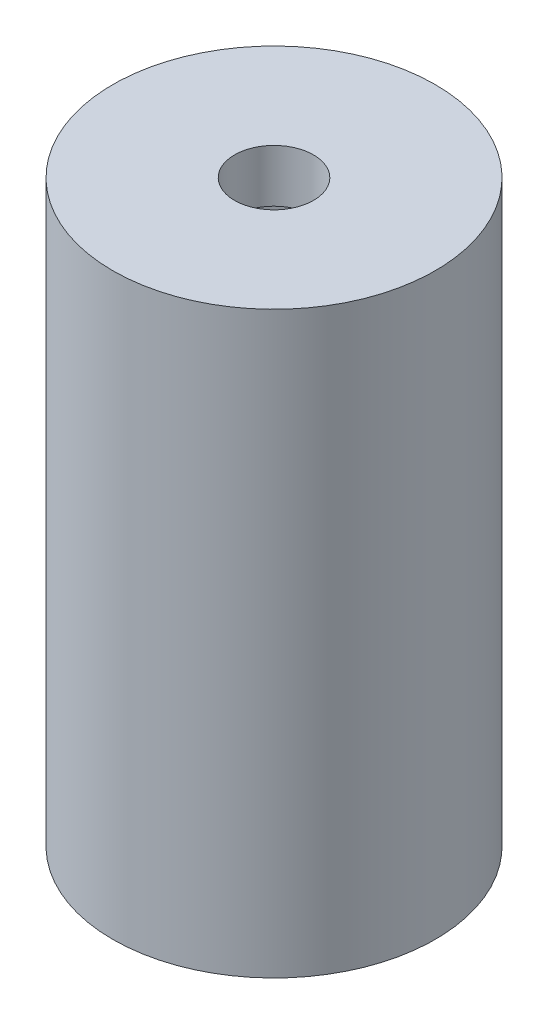
ISO-10303-21;
HEADER;
FILE_DESCRIPTION(('STEP AP214'),'2;1');
FILE_NAME('part.step','',(''),(''),'','','');
FILE_SCHEMA(('AUTOMOTIVE_DESIGN { 1 0 10303 214 1 1 1 1 }'));
ENDSEC;
DATA;
#1=APPLICATION_CONTEXT('core data for automotive mechanical design processes');
#2=APPLICATION_PROTOCOL_DEFINITION('international standard','automotive_design',2000,#1);
#3=PRODUCT_CONTEXT('',#1,'mechanical');
#4=PRODUCT('Part','Part','',(#3));
#5=PRODUCT_RELATED_PRODUCT_CATEGORY('part','',(#4));
#6=PRODUCT_DEFINITION_FORMATION('','',#4);
#7=PRODUCT_DEFINITION_CONTEXT('part definition',#1,'design');
#8=PRODUCT_DEFINITION('design','',#6,#7);
#9=PRODUCT_DEFINITION_SHAPE('','',#8);
#10=(LENGTH_UNIT() NAMED_UNIT(*) SI_UNIT(.MILLI.,.METRE.));
#11=(NAMED_UNIT(*) PLANE_ANGLE_UNIT() SI_UNIT($,.RADIAN.));
#12=(NAMED_UNIT(*) SI_UNIT($,.STERADIAN.) SOLID_ANGLE_UNIT());
#13=UNCERTAINTY_MEASURE_WITH_UNIT(LENGTH_MEASURE(1.E-05),#10,'distance_accuracy_value','');
#14=(GEOMETRIC_REPRESENTATION_CONTEXT(3) GLOBAL_UNCERTAINTY_ASSIGNED_CONTEXT((#13)) GLOBAL_UNIT_ASSIGNED_CONTEXT((#10,
#11,#12)) REPRESENTATION_CONTEXT('',''));
#15=CARTESIAN_POINT('',(0.,0.,0.));
#16=DIRECTION('',(0.,0.,1.));
#17=DIRECTION('',(1.,0.,0.));
#18=AXIS2_PLACEMENT_3D('',#15,#16,#17);
#19=CARTESIAN_POINT('',(0.,40.,0.));
#20=DIRECTION('',(0.,-1.,0.));
#21=DIRECTION('',(0.,0.,-1.));
#22=AXIS2_PLACEMENT_3D('',#19,#20,#21);
#23=CYLINDRICAL_SURFACE('',#22,12.25);
#24=CARTESIAN_POINT('',(0.,0.,0.));
#25=DIRECTION('',(0.,1.,0.));
#26=DIRECTION('',(0.,0.,1.));
#27=AXIS2_PLACEMENT_3D('',#24,#25,#26);
#28=CIRCLE('',#27,12.25);
#29=CARTESIAN_POINT('',(-3.,0.,-11.8769735202197));
#30=VERTEX_POINT('',#29);
#31=CARTESIAN_POINT('',(3.,0.,-11.8769735202197));
#32=VERTEX_POINT('',#31);
#33=EDGE_CURVE('E105',#30,#32,#28,.T.);
#34=ORIENTED_EDGE('',*,*,#33,.T.);
#35=DIRECTION('',(0.,-1.,0.));
#36=VECTOR('',#35,1.);
#37=CARTESIAN_POINT('',(3.,40.,-11.8769735202197));
#38=LINE('',#37,#36);
#39=CARTESIAN_POINT('',(3.,40.,-11.8769735202197));
#40=VERTEX_POINT('',#39);
#41=EDGE_CURVE('E11',#40,#32,#38,.T.);
#42=ORIENTED_EDGE('',*,*,#41,.F.);
#43=CARTESIAN_POINT('',(0.,40.,0.));
#44=DIRECTION('',(0.,1.,0.));
#45=DIRECTION('',(0.,0.,1.));
#46=AXIS2_PLACEMENT_3D('',#43,#44,#45);
#47=CIRCLE('',#46,12.25);
#48=CARTESIAN_POINT('',(-3.,40.,-11.8769735202197));
#49=VERTEX_POINT('',#48);
#50=EDGE_CURVE('E97',#40,#49,#47,.T.);
#51=ORIENTED_EDGE('',*,*,#50,.T.);
#52=DIRECTION('',(0.,-1.,0.));
#53=VECTOR('',#52,1.);
#54=CARTESIAN_POINT('',(-3.,40.,-11.8769735202197));
#55=LINE('',#54,#53);
#56=EDGE_CURVE('E84',#49,#30,#55,.T.);
#57=ORIENTED_EDGE('',*,*,#56,.T.);
#58=EDGE_LOOP('',(#34,#42,#51,#57));
#59=FACE_BOUND('',#58,.T.);
#60=CARTESIAN_POINT('',(0.,44.,0.));
#61=DIRECTION('',(0.,1.,0.));
#62=DIRECTION('',(0.,0.,1.));
#63=AXIS2_PLACEMENT_3D('',#60,#61,#62);
#64=CIRCLE('',#63,12.25);
#65=CARTESIAN_POINT('',(0.,44.,12.25));
#66=VERTEX_POINT('',#65);
#67=EDGE_CURVE('E101',#66,#66,#64,.T.);
#68=ORIENTED_EDGE('',*,*,#67,.F.);
#69=EDGE_LOOP('',(#68));
#70=FACE_BOUND('',#69,.T.);
#71=ADVANCED_FACE('F39',(#59,#70),#23,.T.);
#72=CARTESIAN_POINT('',(3.,40.,-11.8769735202197));
#73=DIRECTION('',(1.,0.,0.));
#74=DIRECTION('',(0.,0.,-1.));
#75=AXIS2_PLACEMENT_3D('',#72,#73,#74);
#76=PLANE('',#75);
#77=DIRECTION('',(0.,0.,1.));
#78=VECTOR('',#77,1.);
#79=CARTESIAN_POINT('',(3.,0.,-11.8769735202197));
#80=LINE('',#79,#78);
#81=CARTESIAN_POINT('',(3.,0.,-8.48528137423857));
#82=VERTEX_POINT('',#81);
#83=EDGE_CURVE('E115',#32,#82,#80,.T.);
#84=ORIENTED_EDGE('',*,*,#83,.T.);
#85=DIRECTION('',(0.,-1.,0.));
#86=VECTOR('',#85,1.);
#87=CARTESIAN_POINT('',(3.,40.,-8.48528137423857));
#88=LINE('',#87,#86);
#89=CARTESIAN_POINT('',(3.,40.,-8.48528137423857));
#90=VERTEX_POINT('',#89);
#91=EDGE_CURVE('E47',#90,#82,#88,.T.);
#92=ORIENTED_EDGE('',*,*,#91,.F.);
#93=DIRECTION('',(0.,0.,1.));
#94=VECTOR('',#93,1.);
#95=CARTESIAN_POINT('',(3.,40.,-11.8769735202197));
#96=LINE('',#95,#94);
#97=EDGE_CURVE('E81',#40,#90,#96,.T.);
#98=ORIENTED_EDGE('',*,*,#97,.F.);
#99=ORIENTED_EDGE('',*,*,#41,.T.);
#100=EDGE_LOOP('',(#84,#92,#98,#99));
#101=FACE_BOUND('',#100,.T.);
#102=ADVANCED_FACE('F122',(#101),#76,.F.);
#103=CARTESIAN_POINT('',(0.,40.,0.));
#104=DIRECTION('',(0.,-1.,0.));
#105=DIRECTION('',(0.,0.,-1.));
#106=AXIS2_PLACEMENT_3D('',#103,#104,#105);
#107=CYLINDRICAL_SURFACE('',#106,9.);
#108=CARTESIAN_POINT('',(0.,0.,0.));
#109=DIRECTION('',(0.,-1.,0.));
#110=DIRECTION('',(0.,0.,1.));
#111=AXIS2_PLACEMENT_3D('',#108,#109,#110);
#112=CIRCLE('',#111,9.);
#113=CARTESIAN_POINT('',(-3.,0.,-8.48528137423857));
#114=VERTEX_POINT('',#113);
#115=EDGE_CURVE('E71',#82,#114,#112,.T.);
#116=ORIENTED_EDGE('',*,*,#115,.T.);
#117=DIRECTION('',(0.,-1.,0.));
#118=VECTOR('',#117,1.);
#119=CARTESIAN_POINT('',(-3.,40.,-8.48528137423857));
#120=LINE('',#119,#118);
#121=CARTESIAN_POINT('',(-3.,40.,-8.48528137423857));
#122=VERTEX_POINT('',#121);
#123=EDGE_CURVE('E55',#122,#114,#120,.T.);
#124=ORIENTED_EDGE('',*,*,#123,.F.);
#125=CARTESIAN_POINT('',(0.,40.,0.));
#126=DIRECTION('',(0.,-1.,0.));
#127=DIRECTION('',(0.,0.,1.));
#128=AXIS2_PLACEMENT_3D('',#125,#126,#127);
#129=CIRCLE('',#128,9.);
#130=EDGE_CURVE('E98',#90,#122,#129,.T.);
#131=ORIENTED_EDGE('',*,*,#130,.F.);
#132=ORIENTED_EDGE('',*,*,#91,.T.);
#133=EDGE_LOOP('',(#116,#124,#131,#132));
#134=FACE_BOUND('',#133,.T.);
#135=ADVANCED_FACE('F119',(#134),#107,.F.);
#136=CARTESIAN_POINT('',(-3.,40.,-11.8769735202197));
#137=DIRECTION('',(-1.,0.,0.));
#138=DIRECTION('',(0.,0.,1.));
#139=AXIS2_PLACEMENT_3D('',#136,#137,#138);
#140=PLANE('',#139);
#141=DIRECTION('',(0.,0.,-1.));
#142=VECTOR('',#141,1.);
#143=CARTESIAN_POINT('',(-3.,0.,-11.8769735202197));
#144=LINE('',#143,#142);
#145=EDGE_CURVE('E76',#114,#30,#144,.T.);
#146=ORIENTED_EDGE('',*,*,#145,.T.);
#147=ORIENTED_EDGE('',*,*,#56,.F.);
#148=DIRECTION('',(0.,0.,-1.));
#149=VECTOR('',#148,1.);
#150=CARTESIAN_POINT('',(-3.,40.,-11.8769735202197));
#151=LINE('',#150,#149);
#152=EDGE_CURVE('E87',#122,#49,#151,.T.);
#153=ORIENTED_EDGE('',*,*,#152,.F.);
#154=ORIENTED_EDGE('',*,*,#123,.T.);
#155=EDGE_LOOP('',(#146,#147,#153,#154));
#156=FACE_BOUND('',#155,.T.);
#157=ADVANCED_FACE('F86',(#156),#140,.F.);
#158=CARTESIAN_POINT('',(0.,0.,0.));
#159=DIRECTION('',(0.,1.,0.));
#160=DIRECTION('',(0.,0.,1.));
#161=AXIS2_PLACEMENT_3D('',#158,#159,#160);
#162=PLANE('',#161);
#163=ORIENTED_EDGE('',*,*,#33,.F.);
#164=ORIENTED_EDGE('',*,*,#145,.F.);
#165=ORIENTED_EDGE('',*,*,#115,.F.);
#166=ORIENTED_EDGE('',*,*,#83,.F.);
#167=EDGE_LOOP('',(#163,#164,#165,#166));
#168=FACE_BOUND('',#167,.T.);
#169=ADVANCED_FACE('F121',(#168),#162,.F.);
#170=CARTESIAN_POINT('',(0.,40.,0.));
#171=DIRECTION('',(0.,1.,0.));
#172=DIRECTION('',(0.,0.,1.));
#173=AXIS2_PLACEMENT_3D('',#170,#171,#172);
#174=PLANE('',#173);
#175=CARTESIAN_POINT('',(0.,40.,0.));
#176=DIRECTION('',(0.,1.,0.));
#177=DIRECTION('',(0.,0.,1.));
#178=AXIS2_PLACEMENT_3D('',#175,#176,#177);
#179=CIRCLE('',#178,3.);
#180=CARTESIAN_POINT('',(0.,40.,3.));
#181=VERTEX_POINT('',#180);
#182=EDGE_CURVE('E102',#181,#181,#179,.T.);
#183=ORIENTED_EDGE('',*,*,#182,.T.);
#184=EDGE_LOOP('',(#183));
#185=FACE_BOUND('',#184,.T.);
#186=ORIENTED_EDGE('',*,*,#50,.F.);
#187=ORIENTED_EDGE('',*,*,#97,.T.);
#188=ORIENTED_EDGE('',*,*,#130,.T.);
#189=ORIENTED_EDGE('',*,*,#152,.T.);
#190=EDGE_LOOP('',(#186,#187,#188,#189));
#191=FACE_BOUND('',#190,.T.);
#192=ADVANCED_FACE('F96',(#185,#191),#174,.F.);
#193=CARTESIAN_POINT('',(0.,44.,0.));
#194=DIRECTION('',(0.,1.,0.));
#195=DIRECTION('',(0.,0.,1.));
#196=AXIS2_PLACEMENT_3D('',#193,#194,#195);
#197=PLANE('',#196);
#198=CARTESIAN_POINT('',(0.,44.,0.));
#199=DIRECTION('',(0.,1.,0.));
#200=DIRECTION('',(0.,0.,1.));
#201=AXIS2_PLACEMENT_3D('',#198,#199,#200);
#202=CIRCLE('',#201,3.);
#203=CARTESIAN_POINT('',(0.,44.,3.));
#204=VERTEX_POINT('',#203);
#205=EDGE_CURVE('E108',#204,#204,#202,.T.);
#206=ORIENTED_EDGE('',*,*,#205,.F.);
#207=EDGE_LOOP('',(#206));
#208=FACE_BOUND('',#207,.T.);
#209=ORIENTED_EDGE('',*,*,#67,.T.);
#210=EDGE_LOOP('',(#209));
#211=FACE_BOUND('',#210,.T.);
#212=ADVANCED_FACE('F137',(#208,#211),#197,.T.);
#213=CARTESIAN_POINT('',(0.,40.,0.));
#214=DIRECTION('',(0.,1.,0.));
#215=DIRECTION('',(0.,0.,1.));
#216=AXIS2_PLACEMENT_3D('',#213,#214,#215);
#217=CYLINDRICAL_SURFACE('',#216,3.);
#218=ORIENTED_EDGE('',*,*,#182,.F.);
#219=EDGE_LOOP('',(#218));
#220=FACE_BOUND('',#219,.T.);
#221=ORIENTED_EDGE('',*,*,#205,.T.);
#222=EDGE_LOOP('',(#221));
#223=FACE_BOUND('',#222,.T.);
#224=ADVANCED_FACE('F141',(#220,#223),#217,.F.);
#225=CLOSED_SHELL('',(#71,#102,#135,#157,#169,#192,#212,#224));
#226=MANIFOLD_SOLID_BREP('B2',#225);
#227=ADVANCED_BREP_SHAPE_REPRESENTATION('',(#18,#226),#14);
#228=SHAPE_DEFINITION_REPRESENTATION(#9,#227);
ENDSEC;
END-ISO-10303-21;
